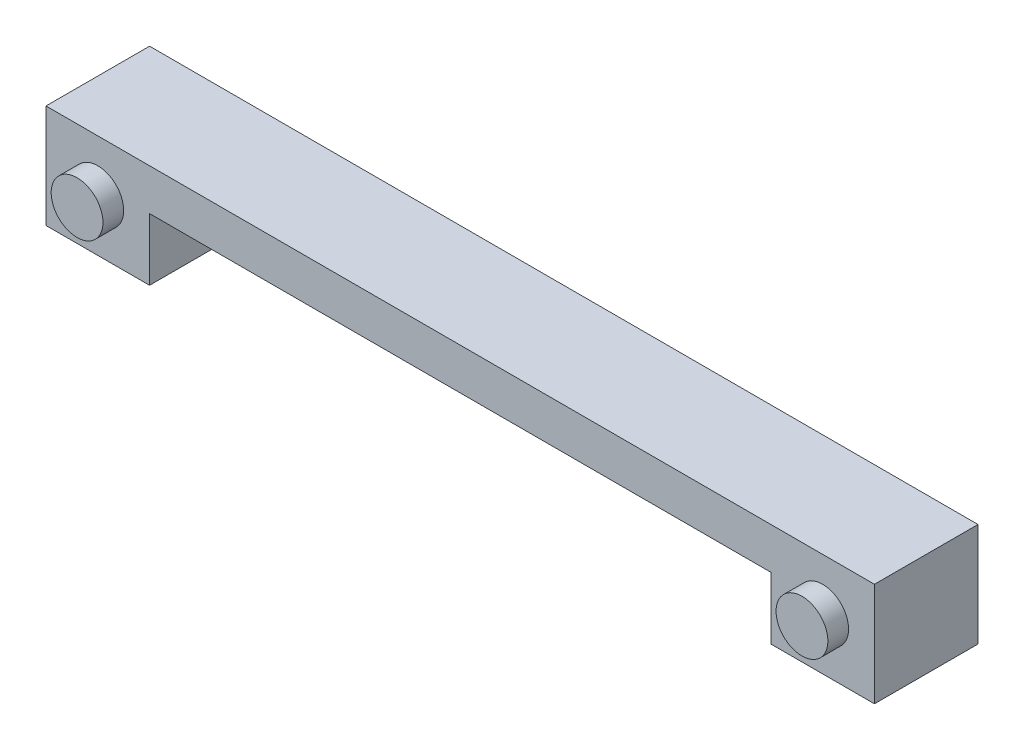
ISO-10303-21;
HEADER;
FILE_DESCRIPTION(('STEP AP214'),'2;1');
FILE_NAME('part.step','',(''),(''),'','','');
FILE_SCHEMA(('AUTOMOTIVE_DESIGN { 1 0 10303 214 1 1 1 1 }'));
ENDSEC;
DATA;
#1=APPLICATION_CONTEXT('core data for automotive mechanical design processes');
#2=APPLICATION_PROTOCOL_DEFINITION('international standard','automotive_design',2000,#1);
#3=PRODUCT_CONTEXT('',#1,'mechanical');
#4=PRODUCT('Part','Part','',(#3));
#5=PRODUCT_RELATED_PRODUCT_CATEGORY('part','',(#4));
#6=PRODUCT_DEFINITION_FORMATION('','',#4);
#7=PRODUCT_DEFINITION_CONTEXT('part definition',#1,'design');
#8=PRODUCT_DEFINITION('design','',#6,#7);
#9=PRODUCT_DEFINITION_SHAPE('','',#8);
#10=(LENGTH_UNIT() NAMED_UNIT(*) SI_UNIT(.MILLI.,.METRE.));
#11=(NAMED_UNIT(*) PLANE_ANGLE_UNIT() SI_UNIT($,.RADIAN.));
#12=(NAMED_UNIT(*) SI_UNIT($,.STERADIAN.) SOLID_ANGLE_UNIT());
#13=UNCERTAINTY_MEASURE_WITH_UNIT(LENGTH_MEASURE(1.E-05),#10,'distance_accuracy_value','');
#14=(GEOMETRIC_REPRESENTATION_CONTEXT(3) GLOBAL_UNCERTAINTY_ASSIGNED_CONTEXT((#13)) GLOBAL_UNIT_ASSIGNED_CONTEXT((#10,
#11,#12)) REPRESENTATION_CONTEXT('',''));
#15=CARTESIAN_POINT('',(0.,0.,0.));
#16=DIRECTION('',(0.,0.,1.));
#17=DIRECTION('',(1.,0.,0.));
#18=AXIS2_PLACEMENT_3D('',#15,#16,#17);
#19=CARTESIAN_POINT('',(0.,0.,6.35));
#20=DIRECTION('',(0.,1.,0.));
#21=DIRECTION('',(0.,0.,1.));
#22=AXIS2_PLACEMENT_3D('',#19,#20,#21);
#23=PLANE('',#22);
#24=DIRECTION('',(1.,0.,0.));
#25=VECTOR('',#24,1.);
#26=CARTESIAN_POINT('',(0.,0.,0.));
#27=LINE('',#26,#25);
#28=CARTESIAN_POINT('',(0.,0.,0.));
#29=VERTEX_POINT('',#28);
#30=CARTESIAN_POINT('',(6.35,0.,0.));
#31=VERTEX_POINT('',#30);
#32=EDGE_CURVE('E166',#29,#31,#27,.T.);
#33=ORIENTED_EDGE('',*,*,#32,.T.);
#34=DIRECTION('',(0.,0.,-1.));
#35=VECTOR('',#34,1.);
#36=CARTESIAN_POINT('',(6.35,0.,6.35));
#37=LINE('',#36,#35);
#38=CARTESIAN_POINT('',(6.35,0.,6.35));
#39=VERTEX_POINT('',#38);
#40=EDGE_CURVE('E170',#39,#31,#37,.T.);
#41=ORIENTED_EDGE('',*,*,#40,.F.);
#42=DIRECTION('',(1.,0.,0.));
#43=VECTOR('',#42,1.);
#44=CARTESIAN_POINT('',(0.,0.,6.35));
#45=LINE('',#44,#43);
#46=CARTESIAN_POINT('',(0.,0.,6.35));
#47=VERTEX_POINT('',#46);
#48=EDGE_CURVE('E171',#47,#39,#45,.T.);
#49=ORIENTED_EDGE('',*,*,#48,.F.);
#50=DIRECTION('',(0.,0.,-1.));
#51=VECTOR('',#50,1.);
#52=CARTESIAN_POINT('',(0.,0.,6.35));
#53=LINE('',#52,#51);
#54=EDGE_CURVE('E56',#47,#29,#53,.T.);
#55=ORIENTED_EDGE('',*,*,#54,.T.);
#56=EDGE_LOOP('',(#33,#41,#49,#55));
#57=FACE_BOUND('',#56,.T.);
#58=ADVANCED_FACE('F39',(#57),#23,.F.);
#59=CARTESIAN_POINT('',(6.35,0.,6.35));
#60=DIRECTION('',(-1.,0.,0.));
#61=DIRECTION('',(0.,0.,1.));
#62=AXIS2_PLACEMENT_3D('',#59,#60,#61);
#63=PLANE('',#62);
#64=DIRECTION('',(0.,1.,0.));
#65=VECTOR('',#64,1.);
#66=CARTESIAN_POINT('',(6.35,0.,0.));
#67=LINE('',#66,#65);
#68=CARTESIAN_POINT('',(6.35,3.81,0.));
#69=VERTEX_POINT('',#68);
#70=EDGE_CURVE('E188',#31,#69,#67,.T.);
#71=ORIENTED_EDGE('',*,*,#70,.T.);
#72=DIRECTION('',(0.,0.,-1.));
#73=VECTOR('',#72,1.);
#74=CARTESIAN_POINT('',(6.35,3.81,6.35));
#75=LINE('',#74,#73);
#76=CARTESIAN_POINT('',(6.35,3.81,6.35));
#77=VERTEX_POINT('',#76);
#78=EDGE_CURVE('E204',#77,#69,#75,.T.);
#79=ORIENTED_EDGE('',*,*,#78,.F.);
#80=DIRECTION('',(0.,1.,0.));
#81=VECTOR('',#80,1.);
#82=CARTESIAN_POINT('',(6.35,0.,6.35));
#83=LINE('',#82,#81);
#84=EDGE_CURVE('E83',#39,#77,#83,.T.);
#85=ORIENTED_EDGE('',*,*,#84,.F.);
#86=ORIENTED_EDGE('',*,*,#40,.T.);
#87=EDGE_LOOP('',(#71,#79,#85,#86));
#88=FACE_BOUND('',#87,.T.);
#89=ADVANCED_FACE('F209',(#88),#63,.F.);
#90=CARTESIAN_POINT('',(0.,3.81,6.35));
#91=DIRECTION('',(0.,1.,0.));
#92=DIRECTION('',(0.,0.,1.));
#93=AXIS2_PLACEMENT_3D('',#90,#91,#92);
#94=PLANE('',#93);
#95=DIRECTION('',(1.,0.,0.));
#96=VECTOR('',#95,1.);
#97=CARTESIAN_POINT('',(0.,3.81,0.));
#98=LINE('',#97,#96);
#99=CARTESIAN_POINT('',(44.45,3.81,0.));
#100=VERTEX_POINT('',#99);
#101=EDGE_CURVE('E191',#69,#100,#98,.T.);
#102=ORIENTED_EDGE('',*,*,#101,.T.);
#103=DIRECTION('',(0.,0.,-1.));
#104=VECTOR('',#103,1.);
#105=CARTESIAN_POINT('',(44.45,3.81,6.35));
#106=LINE('',#105,#104);
#107=CARTESIAN_POINT('',(44.45,3.81,6.35));
#108=VERTEX_POINT('',#107);
#109=EDGE_CURVE('E157',#108,#100,#106,.T.);
#110=ORIENTED_EDGE('',*,*,#109,.F.);
#111=DIRECTION('',(1.,0.,0.));
#112=VECTOR('',#111,1.);
#113=CARTESIAN_POINT('',(0.,3.81,6.35));
#114=LINE('',#113,#112);
#115=EDGE_CURVE('E177',#77,#108,#114,.T.);
#116=ORIENTED_EDGE('',*,*,#115,.F.);
#117=ORIENTED_EDGE('',*,*,#78,.T.);
#118=EDGE_LOOP('',(#102,#110,#116,#117));
#119=FACE_BOUND('',#118,.T.);
#120=ADVANCED_FACE('F223',(#119),#94,.F.);
#121=CARTESIAN_POINT('',(0.,6.35,6.35));
#122=DIRECTION('',(0.,1.,0.));
#123=DIRECTION('',(0.,0.,1.));
#124=AXIS2_PLACEMENT_3D('',#121,#122,#123);
#125=PLANE('',#124);
#126=DIRECTION('',(1.,0.,0.));
#127=VECTOR('',#126,1.);
#128=CARTESIAN_POINT('',(0.,6.35,0.));
#129=LINE('',#128,#127);
#130=CARTESIAN_POINT('',(0.,6.35,0.));
#131=VERTEX_POINT('',#130);
#132=CARTESIAN_POINT('',(50.8,6.35,0.));
#133=VERTEX_POINT('',#132);
#134=EDGE_CURVE('E194',#131,#133,#129,.T.);
#135=ORIENTED_EDGE('',*,*,#134,.F.);
#136=DIRECTION('',(0.,0.,-1.));
#137=VECTOR('',#136,1.);
#138=CARTESIAN_POINT('',(0.,6.35,6.35));
#139=LINE('',#138,#137);
#140=CARTESIAN_POINT('',(0.,6.35,6.35));
#141=VERTEX_POINT('',#140);
#142=EDGE_CURVE('E71',#141,#131,#139,.T.);
#143=ORIENTED_EDGE('',*,*,#142,.F.);
#144=DIRECTION('',(1.,0.,0.));
#145=VECTOR('',#144,1.);
#146=CARTESIAN_POINT('',(0.,6.35,6.35));
#147=LINE('',#146,#145);
#148=CARTESIAN_POINT('',(50.8,6.35,6.35));
#149=VERTEX_POINT('',#148);
#150=EDGE_CURVE('E180',#141,#149,#147,.T.);
#151=ORIENTED_EDGE('',*,*,#150,.T.);
#152=DIRECTION('',(0.,0.,-1.));
#153=VECTOR('',#152,1.);
#154=CARTESIAN_POINT('',(50.8,6.35,6.35));
#155=LINE('',#154,#153);
#156=EDGE_CURVE('E124',#149,#133,#155,.T.);
#157=ORIENTED_EDGE('',*,*,#156,.T.);
#158=EDGE_LOOP('',(#135,#143,#151,#157));
#159=FACE_BOUND('',#158,.T.);
#160=ADVANCED_FACE('F215',(#159),#125,.T.);
#161=CARTESIAN_POINT('',(0.,0.,6.35));
#162=DIRECTION('',(-1.,0.,0.));
#163=DIRECTION('',(0.,0.,1.));
#164=AXIS2_PLACEMENT_3D('',#161,#162,#163);
#165=PLANE('',#164);
#166=DIRECTION('',(0.,1.,0.));
#167=VECTOR('',#166,1.);
#168=CARTESIAN_POINT('',(0.,0.,0.));
#169=LINE('',#168,#167);
#170=EDGE_CURVE('E174',#29,#131,#169,.T.);
#171=ORIENTED_EDGE('',*,*,#170,.F.);
#172=ORIENTED_EDGE('',*,*,#54,.F.);
#173=DIRECTION('',(0.,1.,0.));
#174=VECTOR('',#173,1.);
#175=CARTESIAN_POINT('',(0.,0.,6.35));
#176=LINE('',#175,#174);
#177=EDGE_CURVE('E183',#47,#141,#176,.T.);
#178=ORIENTED_EDGE('',*,*,#177,.T.);
#179=ORIENTED_EDGE('',*,*,#142,.T.);
#180=EDGE_LOOP('',(#171,#172,#178,#179));
#181=FACE_BOUND('',#180,.T.);
#182=ADVANCED_FACE('F213',(#181),#165,.T.);
#183=CARTESIAN_POINT('',(0.,0.,6.35));
#184=DIRECTION('',(0.,0.,1.));
#185=DIRECTION('',(1.,0.,0.));
#186=AXIS2_PLACEMENT_3D('',#183,#184,#185);
#187=PLANE('',#186);
#188=CARTESIAN_POINT('',(47.625,3.175,6.35));
#189=DIRECTION('',(0.,0.,1.));
#190=DIRECTION('',(1.,0.,0.));
#191=AXIS2_PLACEMENT_3D('',#188,#189,#190);
#192=CIRCLE('',#191,1.5875);
#193=CARTESIAN_POINT('',(49.2125,3.175,6.35));
#194=VERTEX_POINT('',#193);
#195=EDGE_CURVE('E11',#194,#194,#192,.T.);
#196=ORIENTED_EDGE('',*,*,#195,.F.);
#197=EDGE_LOOP('',(#196));
#198=FACE_BOUND('',#197,.T.);
#199=CARTESIAN_POINT('',(3.175,3.175,6.35));
#200=DIRECTION('',(0.,0.,1.));
#201=DIRECTION('',(1.,0.,0.));
#202=AXIS2_PLACEMENT_3D('',#199,#200,#201);
#203=CIRCLE('',#202,1.5875);
#204=CARTESIAN_POINT('',(4.7625,3.175,6.35));
#205=VERTEX_POINT('',#204);
#206=EDGE_CURVE('E48',#205,#205,#203,.T.);
#207=ORIENTED_EDGE('',*,*,#206,.F.);
#208=EDGE_LOOP('',(#207));
#209=FACE_BOUND('',#208,.T.);
#210=ORIENTED_EDGE('',*,*,#48,.T.);
#211=ORIENTED_EDGE('',*,*,#84,.T.);
#212=ORIENTED_EDGE('',*,*,#115,.T.);
#213=DIRECTION('',(0.,1.,0.));
#214=VECTOR('',#213,1.);
#215=CARTESIAN_POINT('',(44.45,0.,6.35));
#216=LINE('',#215,#214);
#217=CARTESIAN_POINT('',(44.45,0.,6.35));
#218=VERTEX_POINT('',#217);
#219=EDGE_CURVE('E134',#218,#108,#216,.T.);
#220=ORIENTED_EDGE('',*,*,#219,.F.);
#221=DIRECTION('',(-1.,0.,0.));
#222=VECTOR('',#221,1.);
#223=CARTESIAN_POINT('',(50.8,0.,6.35));
#224=LINE('',#223,#222);
#225=CARTESIAN_POINT('',(50.8,0.,6.35));
#226=VERTEX_POINT('',#225);
#227=EDGE_CURVE('E115',#226,#218,#224,.T.);
#228=ORIENTED_EDGE('',*,*,#227,.F.);
#229=DIRECTION('',(0.,1.,0.));
#230=VECTOR('',#229,1.);
#231=CARTESIAN_POINT('',(50.8,0.,6.35));
#232=LINE('',#231,#230);
#233=EDGE_CURVE('E128',#226,#149,#232,.T.);
#234=ORIENTED_EDGE('',*,*,#233,.T.);
#235=ORIENTED_EDGE('',*,*,#150,.F.);
#236=ORIENTED_EDGE('',*,*,#177,.F.);
#237=EDGE_LOOP('',(#210,#211,#212,#220,#228,#234,#235,#236));
#238=FACE_BOUND('',#237,.T.);
#239=ADVANCED_FACE('F136',(#198,#209,#238),#187,.T.);
#240=CARTESIAN_POINT('',(0.,0.,0.));
#241=DIRECTION('',(0.,0.,1.));
#242=DIRECTION('',(1.,0.,0.));
#243=AXIS2_PLACEMENT_3D('',#240,#241,#242);
#244=PLANE('',#243);
#245=ORIENTED_EDGE('',*,*,#32,.F.);
#246=ORIENTED_EDGE('',*,*,#170,.T.);
#247=ORIENTED_EDGE('',*,*,#134,.T.);
#248=DIRECTION('',(0.,1.,0.));
#249=VECTOR('',#248,1.);
#250=CARTESIAN_POINT('',(50.8,0.,0.));
#251=LINE('',#250,#249);
#252=CARTESIAN_POINT('',(50.8,0.,0.));
#253=VERTEX_POINT('',#252);
#254=EDGE_CURVE('E143',#253,#133,#251,.T.);
#255=ORIENTED_EDGE('',*,*,#254,.F.);
#256=DIRECTION('',(-1.,0.,0.));
#257=VECTOR('',#256,1.);
#258=CARTESIAN_POINT('',(50.8,0.,0.));
#259=LINE('',#258,#257);
#260=CARTESIAN_POINT('',(44.45,0.,0.));
#261=VERTEX_POINT('',#260);
#262=EDGE_CURVE('E118',#253,#261,#259,.T.);
#263=ORIENTED_EDGE('',*,*,#262,.T.);
#264=DIRECTION('',(0.,1.,0.));
#265=VECTOR('',#264,1.);
#266=CARTESIAN_POINT('',(44.45,0.,0.));
#267=LINE('',#266,#265);
#268=EDGE_CURVE('E139',#261,#100,#267,.T.);
#269=ORIENTED_EDGE('',*,*,#268,.T.);
#270=ORIENTED_EDGE('',*,*,#101,.F.);
#271=ORIENTED_EDGE('',*,*,#70,.F.);
#272=EDGE_LOOP('',(#245,#246,#247,#255,#263,#269,#270,#271));
#273=FACE_BOUND('',#272,.T.);
#274=ADVANCED_FACE('F211',(#273),#244,.F.);
#275=CARTESIAN_POINT('',(3.175,3.175,7.62));
#276=DIRECTION('',(0.,0.,-1.));
#277=DIRECTION('',(-1.,0.,0.));
#278=AXIS2_PLACEMENT_3D('',#275,#276,#277);
#279=CYLINDRICAL_SURFACE('',#278,1.5875);
#280=CARTESIAN_POINT('',(3.175,3.175,7.62));
#281=DIRECTION('',(0.,0.,1.));
#282=DIRECTION('',(1.,0.,0.));
#283=AXIS2_PLACEMENT_3D('',#280,#281,#282);
#284=CIRCLE('',#283,1.5875);
#285=CARTESIAN_POINT('',(4.7625,3.175,7.62));
#286=VERTEX_POINT('',#285);
#287=EDGE_CURVE('E123',#286,#286,#284,.T.);
#288=ORIENTED_EDGE('',*,*,#287,.F.);
#289=EDGE_LOOP('',(#288));
#290=FACE_BOUND('',#289,.T.);
#291=ORIENTED_EDGE('',*,*,#206,.T.);
#292=EDGE_LOOP('',(#291));
#293=FACE_BOUND('',#292,.T.);
#294=ADVANCED_FACE('F262',(#290,#293),#279,.T.);
#295=CARTESIAN_POINT('',(3.175,3.175,7.62));
#296=DIRECTION('',(0.,0.,1.));
#297=DIRECTION('',(1.,0.,0.));
#298=AXIS2_PLACEMENT_3D('',#295,#296,#297);
#299=PLANE('',#298);
#300=ORIENTED_EDGE('',*,*,#287,.T.);
#301=EDGE_LOOP('',(#300));
#302=FACE_BOUND('',#301,.T.);
#303=ADVANCED_FACE('F259',(#302),#299,.T.);
#304=CARTESIAN_POINT('',(50.8,0.,6.35));
#305=DIRECTION('',(0.,-1.,0.));
#306=DIRECTION('',(0.,0.,-1.));
#307=AXIS2_PLACEMENT_3D('',#304,#305,#306);
#308=PLANE('',#307);
#309=ORIENTED_EDGE('',*,*,#262,.F.);
#310=DIRECTION('',(0.,0.,-1.));
#311=VECTOR('',#310,1.);
#312=CARTESIAN_POINT('',(50.8,0.,6.35));
#313=LINE('',#312,#311);
#314=EDGE_CURVE('E111',#226,#253,#313,.T.);
#315=ORIENTED_EDGE('',*,*,#314,.F.);
#316=ORIENTED_EDGE('',*,*,#227,.T.);
#317=DIRECTION('',(0.,0.,-1.));
#318=VECTOR('',#317,1.);
#319=CARTESIAN_POINT('',(44.45,0.,6.35));
#320=LINE('',#319,#318);
#321=EDGE_CURVE('E150',#218,#261,#320,.T.);
#322=ORIENTED_EDGE('',*,*,#321,.T.);
#323=EDGE_LOOP('',(#309,#315,#316,#322));
#324=FACE_BOUND('',#323,.T.);
#325=ADVANCED_FACE('F113',(#324),#308,.T.);
#326=CARTESIAN_POINT('',(50.8,0.,6.35));
#327=DIRECTION('',(-1.,0.,0.));
#328=DIRECTION('',(0.,0.,1.));
#329=AXIS2_PLACEMENT_3D('',#326,#327,#328);
#330=PLANE('',#329);
#331=ORIENTED_EDGE('',*,*,#254,.T.);
#332=ORIENTED_EDGE('',*,*,#156,.F.);
#333=ORIENTED_EDGE('',*,*,#233,.F.);
#334=ORIENTED_EDGE('',*,*,#314,.T.);
#335=EDGE_LOOP('',(#331,#332,#333,#334));
#336=FACE_BOUND('',#335,.T.);
#337=ADVANCED_FACE('F129',(#336),#330,.F.);
#338=CARTESIAN_POINT('',(44.45,0.,6.35));
#339=DIRECTION('',(-1.,0.,0.));
#340=DIRECTION('',(0.,0.,1.));
#341=AXIS2_PLACEMENT_3D('',#338,#339,#340);
#342=PLANE('',#341);
#343=ORIENTED_EDGE('',*,*,#268,.F.);
#344=ORIENTED_EDGE('',*,*,#321,.F.);
#345=ORIENTED_EDGE('',*,*,#219,.T.);
#346=ORIENTED_EDGE('',*,*,#109,.T.);
#347=EDGE_LOOP('',(#343,#344,#345,#346));
#348=FACE_BOUND('',#347,.T.);
#349=ADVANCED_FACE('F242',(#348),#342,.T.);
#350=CARTESIAN_POINT('',(47.625,3.175,7.62));
#351=DIRECTION('',(0.,0.,-1.));
#352=DIRECTION('',(-1.,0.,0.));
#353=AXIS2_PLACEMENT_3D('',#350,#351,#352);
#354=CYLINDRICAL_SURFACE('',#353,1.5875);
#355=CARTESIAN_POINT('',(47.625,3.175,7.62));
#356=DIRECTION('',(0.,0.,-1.));
#357=DIRECTION('',(-1.,0.,0.));
#358=AXIS2_PLACEMENT_3D('',#355,#356,#357);
#359=CIRCLE('',#358,1.5875);
#360=CARTESIAN_POINT('',(46.0375,3.175,7.62));
#361=VERTEX_POINT('',#360);
#362=EDGE_CURVE('E146',#361,#361,#359,.T.);
#363=ORIENTED_EDGE('',*,*,#362,.T.);
#364=EDGE_LOOP('',(#363));
#365=FACE_BOUND('',#364,.T.);
#366=ORIENTED_EDGE('',*,*,#195,.T.);
#367=EDGE_LOOP('',(#366));
#368=FACE_BOUND('',#367,.T.);
#369=ADVANCED_FACE('F245',(#365,#368),#354,.T.);
#370=CARTESIAN_POINT('',(47.625,3.175,7.62));
#371=DIRECTION('',(0.,0.,1.));
#372=DIRECTION('',(-1.,0.,0.));
#373=AXIS2_PLACEMENT_3D('',#370,#371,#372);
#374=PLANE('',#373);
#375=ORIENTED_EDGE('',*,*,#362,.F.);
#376=EDGE_LOOP('',(#375));
#377=FACE_BOUND('',#376,.T.);
#378=ADVANCED_FACE('F251',(#377),#374,.T.);
#379=CLOSED_SHELL('',(#58,#89,#120,#160,#182,#239,#274,#294,#303,#325,#337,#349,#369,#378));
#380=MANIFOLD_SOLID_BREP('B2',#379);
#381=ADVANCED_BREP_SHAPE_REPRESENTATION('',(#18,#380),#14);
#382=SHAPE_DEFINITION_REPRESENTATION(#9,#381);
ENDSEC;
END-ISO-10303-21;
